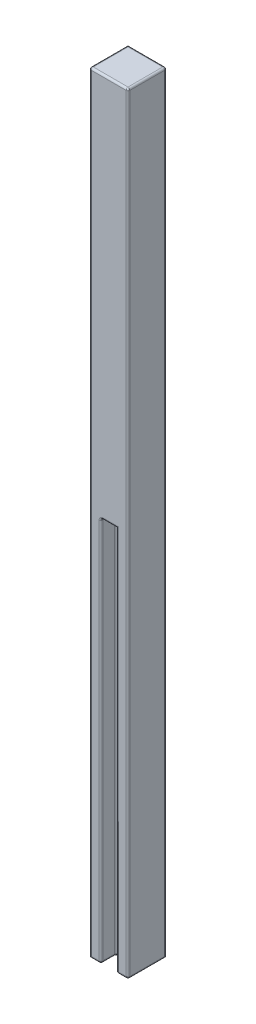
ISO-10303-21;
HEADER;
FILE_DESCRIPTION(('STEP AP214'),'2;1');
FILE_NAME('part.step','',(''),(''),'','','');
FILE_SCHEMA(('AUTOMOTIVE_DESIGN { 1 0 10303 214 1 1 1 1 }'));
ENDSEC;
DATA;
#1=APPLICATION_CONTEXT('core data for automotive mechanical design processes');
#2=APPLICATION_PROTOCOL_DEFINITION('international standard','automotive_design',2000,#1);
#3=PRODUCT_CONTEXT('',#1,'mechanical');
#4=PRODUCT('Part','Part','',(#3));
#5=PRODUCT_RELATED_PRODUCT_CATEGORY('part','',(#4));
#6=PRODUCT_DEFINITION_FORMATION('','',#4);
#7=PRODUCT_DEFINITION_CONTEXT('part definition',#1,'design');
#8=PRODUCT_DEFINITION('design','',#6,#7);
#9=PRODUCT_DEFINITION_SHAPE('','',#8);
#10=(LENGTH_UNIT() NAMED_UNIT(*) SI_UNIT(.MILLI.,.METRE.));
#11=(NAMED_UNIT(*) PLANE_ANGLE_UNIT() SI_UNIT($,.RADIAN.));
#12=(NAMED_UNIT(*) SI_UNIT($,.STERADIAN.) SOLID_ANGLE_UNIT());
#13=UNCERTAINTY_MEASURE_WITH_UNIT(LENGTH_MEASURE(1.E-05),#10,'distance_accuracy_value','');
#14=(GEOMETRIC_REPRESENTATION_CONTEXT(3) GLOBAL_UNCERTAINTY_ASSIGNED_CONTEXT((#13)) GLOBAL_UNIT_ASSIGNED_CONTEXT((#10,
#11,#12)) REPRESENTATION_CONTEXT('',''));
#15=CARTESIAN_POINT('',(0.,0.,0.));
#16=DIRECTION('',(0.,0.,1.));
#17=DIRECTION('',(1.,0.,0.));
#18=AXIS2_PLACEMENT_3D('',#15,#16,#17);
#19=CARTESIAN_POINT('',(-43.4918902303552,200.,-32.6944400252682));
#20=DIRECTION('',(1.,0.,0.));
#21=DIRECTION('',(0.,0.,-1.));
#22=AXIS2_PLACEMENT_3D('',#19,#20,#21);
#23=PLANE('',#22);
#24=DIRECTION('',(0.,-1.,0.));
#25=VECTOR('',#24,1.);
#26=CARTESIAN_POINT('',(-43.4918902303552,200.,-23.1944400252682));
#27=LINE('',#26,#25);
#28=CARTESIAN_POINT('',(-43.4918902303552,0.,-23.1944400252682));
#29=VERTEX_POINT('',#28);
#30=CARTESIAN_POINT('',(-43.4918902303552,199.5,-23.1944400252682));
#31=VERTEX_POINT('',#30);
#32=EDGE_CURVE('E58',#29,#31,#27,.F.);
#33=ORIENTED_EDGE('',*,*,#32,.T.);
#34=DIRECTION('',(0.,0.,1.));
#35=VECTOR('',#34,1.);
#36=CARTESIAN_POINT('',(-43.4918902303552,199.5,-32.6944400252682));
#37=LINE('',#36,#35);
#38=CARTESIAN_POINT('',(-43.4918902303552,199.5,-32.6944400252682));
#39=VERTEX_POINT('',#38);
#40=EDGE_CURVE('E187',#31,#39,#37,.F.);
#41=ORIENTED_EDGE('',*,*,#40,.T.);
#42=DIRECTION('',(0.,-1.,0.));
#43=VECTOR('',#42,1.);
#44=CARTESIAN_POINT('',(-43.4918902303552,200.,-32.6944400252682));
#45=LINE('',#44,#43);
#46=CARTESIAN_POINT('',(-43.4918902303552,0.,-32.6944400252682));
#47=VERTEX_POINT('',#46);
#48=EDGE_CURVE('E183',#39,#47,#45,.T.);
#49=ORIENTED_EDGE('',*,*,#48,.T.);
#50=DIRECTION('',(0.,0.,1.));
#51=VECTOR('',#50,1.);
#52=CARTESIAN_POINT('',(-43.4918902303552,0.,-32.6944400252682));
#53=LINE('',#52,#51);
#54=EDGE_CURVE('E186',#47,#29,#53,.T.);
#55=ORIENTED_EDGE('',*,*,#54,.T.);
#56=EDGE_LOOP('',(#33,#41,#49,#55));
#57=FACE_BOUND('',#56,.T.);
#58=ADVANCED_FACE('F35',(#57),#23,.F.);
#59=CARTESIAN_POINT('',(-43.4918902303552,200.,-22.6944400252682));
#60=DIRECTION('',(0.,0.,-1.));
#61=DIRECTION('',(-1.,0.,0.));
#62=AXIS2_PLACEMENT_3D('',#59,#60,#61);
#63=PLANE('',#62);
#64=CARTESIAN_POINT('',(-39.9918902303553,99.5,-22.6944400252682));
#65=DIRECTION('',(0.,0.,-1.));
#66=DIRECTION('',(-1.,0.,0.));
#67=AXIS2_PLACEMENT_3D('',#64,#65,#66);
#68=CIRCLE('',#67,1.);
#69=CARTESIAN_POINT('',(-39.9918902303553,100.5,-22.6944400252682));
#70=VERTEX_POINT('',#69);
#71=CARTESIAN_POINT('',(-40.9918902303553,99.5,-22.6944400252682));
#72=VERTEX_POINT('',#71);
#73=EDGE_CURVE('E254',#70,#72,#68,.F.);
#74=ORIENTED_EDGE('',*,*,#73,.F.);
#75=DIRECTION('',(1.,0.,0.));
#76=VECTOR('',#75,1.);
#77=CARTESIAN_POINT('',(-36.4918902303553,100.5,-22.6944400252682));
#78=LINE('',#77,#76);
#79=CARTESIAN_POINT('',(-35.9918902303553,100.5,-22.6944400252682));
#80=VERTEX_POINT('',#79);
#81=EDGE_CURVE('E256',#70,#80,#78,.T.);
#82=ORIENTED_EDGE('',*,*,#81,.T.);
#83=DIRECTION('',(0.,-1.,0.));
#84=VECTOR('',#83,1.);
#85=CARTESIAN_POINT('',(-35.9918902303553,0.,-22.6944400252682));
#86=LINE('',#85,#84);
#87=CARTESIAN_POINT('',(-35.9918902303553,0.5,-22.6944400252682));
#88=VERTEX_POINT('',#87);
#89=EDGE_CURVE('E252',#80,#88,#86,.T.);
#90=ORIENTED_EDGE('',*,*,#89,.T.);
#91=DIRECTION('',(1.,0.,0.));
#92=VECTOR('',#91,1.);
#93=CARTESIAN_POINT('',(-43.4918902303552,0.5,-22.6944400252682));
#94=LINE('',#93,#92);
#95=CARTESIAN_POINT('',(-33.9918902303552,0.5,-22.6944400252682));
#96=VERTEX_POINT('',#95);
#97=EDGE_CURVE('E250',#88,#96,#94,.T.);
#98=ORIENTED_EDGE('',*,*,#97,.T.);
#99=DIRECTION('',(0.,-1.,0.));
#100=VECTOR('',#99,1.);
#101=CARTESIAN_POINT('',(-33.9918902303552,200.,-22.6944400252682));
#102=LINE('',#101,#100);
#103=CARTESIAN_POINT('',(-33.9918902303552,199.5,-22.6944400252682));
#104=VERTEX_POINT('',#103);
#105=EDGE_CURVE('E248',#96,#104,#102,.F.);
#106=ORIENTED_EDGE('',*,*,#105,.T.);
#107=DIRECTION('',(1.,0.,0.));
#108=VECTOR('',#107,1.);
#109=CARTESIAN_POINT('',(-43.4918902303552,199.5,-22.6944400252682));
#110=LINE('',#109,#108);
#111=CARTESIAN_POINT('',(-42.9918902303552,199.5,-22.6944400252682));
#112=VERTEX_POINT('',#111);
#113=EDGE_CURVE('E241',#104,#112,#110,.F.);
#114=ORIENTED_EDGE('',*,*,#113,.T.);
#115=DIRECTION('',(0.,-1.,0.));
#116=VECTOR('',#115,1.);
#117=CARTESIAN_POINT('',(-42.9918902303552,200.,-22.6944400252682));
#118=LINE('',#117,#116);
#119=CARTESIAN_POINT('',(-42.9918902303552,0.5,-22.6944400252682));
#120=VERTEX_POINT('',#119);
#121=EDGE_CURVE('E239',#112,#120,#118,.T.);
#122=ORIENTED_EDGE('',*,*,#121,.T.);
#123=DIRECTION('',(1.,0.,0.));
#124=VECTOR('',#123,1.);
#125=CARTESIAN_POINT('',(-43.4918902303552,0.5,-22.6944400252682));
#126=LINE('',#125,#124);
#127=CARTESIAN_POINT('',(-40.9918902303553,0.5,-22.6944400252682));
#128=VERTEX_POINT('',#127);
#129=EDGE_CURVE('E243',#120,#128,#126,.T.);
#130=ORIENTED_EDGE('',*,*,#129,.T.);
#131=DIRECTION('',(0.,-1.,0.));
#132=VECTOR('',#131,1.);
#133=CARTESIAN_POINT('',(-40.9918902303553,200.,-22.6944400252682));
#134=LINE('',#133,#132);
#135=EDGE_CURVE('E245',#128,#72,#134,.F.);
#136=ORIENTED_EDGE('',*,*,#135,.T.);
#137=EDGE_LOOP('',(#74,#82,#90,#98,#106,#114,#122,#130,#136));
#138=FACE_BOUND('',#137,.T.);
#139=ADVANCED_FACE('F431',(#138),#63,.F.);
#140=CARTESIAN_POINT('',(-33.4918902303552,200.,-32.6944400252682));
#141=DIRECTION('',(-1.,0.,0.));
#142=DIRECTION('',(0.,0.,1.));
#143=AXIS2_PLACEMENT_3D('',#140,#141,#142);
#144=PLANE('',#143);
#145=DIRECTION('',(0.,0.,-1.));
#146=VECTOR('',#145,1.);
#147=CARTESIAN_POINT('',(-33.4918902303552,0.5,-32.6944400252682));
#148=LINE('',#147,#146);
#149=CARTESIAN_POINT('',(-33.4918902303552,0.5,-23.1944400252682));
#150=VERTEX_POINT('',#149);
#151=CARTESIAN_POINT('',(-33.4918902303552,0.5,-32.1944400252682));
#152=VERTEX_POINT('',#151);
#153=EDGE_CURVE('E277',#150,#152,#148,.T.);
#154=ORIENTED_EDGE('',*,*,#153,.T.);
#155=DIRECTION('',(0.,-1.,0.));
#156=VECTOR('',#155,1.);
#157=CARTESIAN_POINT('',(-33.4918902303552,200.,-32.1944400252682));
#158=LINE('',#157,#156);
#159=CARTESIAN_POINT('',(-33.4918902303552,199.5,-32.1944400252682));
#160=VERTEX_POINT('',#159);
#161=EDGE_CURVE('E280',#152,#160,#158,.F.);
#162=ORIENTED_EDGE('',*,*,#161,.T.);
#163=DIRECTION('',(0.,0.,-1.));
#164=VECTOR('',#163,1.);
#165=CARTESIAN_POINT('',(-33.4918902303552,199.5,-22.6944400252682));
#166=LINE('',#165,#164);
#167=CARTESIAN_POINT('',(-33.4918902303552,199.5,-23.1944400252682));
#168=VERTEX_POINT('',#167);
#169=EDGE_CURVE('E275',#160,#168,#166,.F.);
#170=ORIENTED_EDGE('',*,*,#169,.T.);
#171=DIRECTION('',(0.,-1.,0.));
#172=VECTOR('',#171,1.);
#173=CARTESIAN_POINT('',(-33.4918902303552,200.,-23.1944400252682));
#174=LINE('',#173,#172);
#175=EDGE_CURVE('E273',#168,#150,#174,.T.);
#176=ORIENTED_EDGE('',*,*,#175,.T.);
#177=EDGE_LOOP('',(#154,#162,#170,#176));
#178=FACE_BOUND('',#177,.T.);
#179=ADVANCED_FACE('F436',(#178),#144,.F.);
#180=CARTESIAN_POINT('',(-43.4918902303552,200.,-32.6944400252682));
#181=DIRECTION('',(0.,0.,1.));
#182=DIRECTION('',(1.,0.,0.));
#183=AXIS2_PLACEMENT_3D('',#180,#181,#182);
#184=PLANE('',#183);
#185=ORIENTED_EDGE('',*,*,#48,.F.);
#186=DIRECTION('',(-1.,0.,0.));
#187=VECTOR('',#186,1.);
#188=CARTESIAN_POINT('',(-33.4918902303552,199.5,-32.6944400252682));
#189=LINE('',#188,#187);
#190=CARTESIAN_POINT('',(-33.9918902303552,199.5,-32.6944400252682));
#191=VERTEX_POINT('',#190);
#192=EDGE_CURVE('E11',#39,#191,#189,.F.);
#193=ORIENTED_EDGE('',*,*,#192,.T.);
#194=DIRECTION('',(0.,-1.,0.));
#195=VECTOR('',#194,1.);
#196=CARTESIAN_POINT('',(-33.9918902303552,200.,-32.6944400252682));
#197=LINE('',#196,#195);
#198=CARTESIAN_POINT('',(-33.9918902303552,0.,-32.6944400252682));
#199=VERTEX_POINT('',#198);
#200=EDGE_CURVE('E44',#191,#199,#197,.T.);
#201=ORIENTED_EDGE('',*,*,#200,.T.);
#202=DIRECTION('',(-1.,0.,0.));
#203=VECTOR('',#202,1.);
#204=CARTESIAN_POINT('',(-43.4918902303552,0.,-32.6944400252682));
#205=LINE('',#204,#203);
#206=EDGE_CURVE('E190',#199,#47,#205,.T.);
#207=ORIENTED_EDGE('',*,*,#206,.T.);
#208=EDGE_LOOP('',(#185,#193,#201,#207));
#209=FACE_BOUND('',#208,.T.);
#210=ADVANCED_FACE('F193',(#209),#184,.F.);
#211=CARTESIAN_POINT('',(0.,200.,0.));
#212=DIRECTION('',(0.,1.,0.));
#213=DIRECTION('',(0.,0.,1.));
#214=AXIS2_PLACEMENT_3D('',#211,#212,#213);
#215=PLANE('',#214);
#216=DIRECTION('',(-1.,0.,0.));
#217=VECTOR('',#216,1.);
#218=CARTESIAN_POINT('',(-43.4918902303552,200.,-32.1944400252682));
#219=LINE('',#218,#217);
#220=CARTESIAN_POINT('',(-33.9918902303552,200.,-32.1944400252682));
#221=VERTEX_POINT('',#220);
#222=CARTESIAN_POINT('',(-42.9918902303552,200.,-32.1944400252682));
#223=VERTEX_POINT('',#222);
#224=EDGE_CURVE('E282',#221,#223,#219,.T.);
#225=ORIENTED_EDGE('',*,*,#224,.T.);
#226=DIRECTION('',(0.,0.,1.));
#227=VECTOR('',#226,1.);
#228=CARTESIAN_POINT('',(-42.9918902303552,200.,-22.6944400252682));
#229=LINE('',#228,#227);
#230=CARTESIAN_POINT('',(-42.9918902303552,200.,-23.1944400252682));
#231=VERTEX_POINT('',#230);
#232=EDGE_CURVE('E288',#223,#231,#229,.T.);
#233=ORIENTED_EDGE('',*,*,#232,.T.);
#234=DIRECTION('',(1.,0.,0.));
#235=VECTOR('',#234,1.);
#236=CARTESIAN_POINT('',(-33.4918902303552,200.,-23.1944400252682));
#237=LINE('',#236,#235);
#238=CARTESIAN_POINT('',(-33.9918902303552,200.,-23.1944400252682));
#239=VERTEX_POINT('',#238);
#240=EDGE_CURVE('E286',#231,#239,#237,.T.);
#241=ORIENTED_EDGE('',*,*,#240,.T.);
#242=DIRECTION('',(0.,0.,-1.));
#243=VECTOR('',#242,1.);
#244=CARTESIAN_POINT('',(-33.9918902303552,200.,-32.6944400252682));
#245=LINE('',#244,#243);
#246=EDGE_CURVE('E284',#239,#221,#245,.T.);
#247=ORIENTED_EDGE('',*,*,#246,.T.);
#248=EDGE_LOOP('',(#225,#233,#241,#247));
#249=FACE_BOUND('',#248,.T.);
#250=ADVANCED_FACE('F405',(#249),#215,.T.);
#251=CARTESIAN_POINT('',(0.,0.,0.));
#252=DIRECTION('',(0.,1.,0.));
#253=DIRECTION('',(0.,0.,1.));
#254=AXIS2_PLACEMENT_3D('',#251,#252,#253);
#255=PLANE('',#254);
#256=DIRECTION('',(0.,0.,1.));
#257=VECTOR('',#256,1.);
#258=CARTESIAN_POINT('',(-40.9918902303553,0.,0.));
#259=LINE('',#258,#257);
#260=CARTESIAN_POINT('',(-40.9918902303553,0.,-26.1944400252682));
#261=VERTEX_POINT('',#260);
#262=CARTESIAN_POINT('',(-40.9918902303553,0.,-23.1944400252682));
#263=VERTEX_POINT('',#262);
#264=EDGE_CURVE('E227',#261,#263,#259,.T.);
#265=ORIENTED_EDGE('',*,*,#264,.T.);
#266=DIRECTION('',(1.,0.,0.));
#267=VECTOR('',#266,1.);
#268=CARTESIAN_POINT('',(0.,0.,-23.1944400252682));
#269=LINE('',#268,#267);
#270=EDGE_CURVE('E200',#263,#29,#269,.F.);
#271=ORIENTED_EDGE('',*,*,#270,.T.);
#272=ORIENTED_EDGE('',*,*,#54,.F.);
#273=ORIENTED_EDGE('',*,*,#206,.F.);
#274=DIRECTION('',(0.,0.,-1.));
#275=VECTOR('',#274,1.);
#276=CARTESIAN_POINT('',(-33.9918902303552,0.,0.));
#277=LINE('',#276,#275);
#278=CARTESIAN_POINT('',(-33.9918902303552,0.,-23.1944400252682));
#279=VERTEX_POINT('',#278);
#280=EDGE_CURVE('E212',#199,#279,#277,.F.);
#281=ORIENTED_EDGE('',*,*,#280,.T.);
#282=DIRECTION('',(1.,0.,0.));
#283=VECTOR('',#282,1.);
#284=CARTESIAN_POINT('',(0.,0.,-23.1944400252682));
#285=LINE('',#284,#283);
#286=CARTESIAN_POINT('',(-35.9918902303553,0.,-23.1944400252682));
#287=VERTEX_POINT('',#286);
#288=EDGE_CURVE('E214',#279,#287,#285,.F.);
#289=ORIENTED_EDGE('',*,*,#288,.T.);
#290=DIRECTION('',(0.,0.,1.));
#291=VECTOR('',#290,1.);
#292=CARTESIAN_POINT('',(-35.9918902303553,0.,-26.6944400252682));
#293=LINE('',#292,#291);
#294=CARTESIAN_POINT('',(-35.9918902303553,0.,-26.1944400252682));
#295=VERTEX_POINT('',#294);
#296=EDGE_CURVE('E216',#287,#295,#293,.F.);
#297=ORIENTED_EDGE('',*,*,#296,.T.);
#298=CARTESIAN_POINT('',(-36.9918902303553,0.,-26.1944400252682));
#299=DIRECTION('',(0.,1.,0.));
#300=DIRECTION('',(0.,0.,1.));
#301=AXIS2_PLACEMENT_3D('',#298,#299,#300);
#302=CIRCLE('',#301,1.);
#303=CARTESIAN_POINT('',(-36.9918902303553,0.,-27.1944400252682));
#304=VERTEX_POINT('',#303);
#305=EDGE_CURVE('E219',#304,#295,#302,.F.);
#306=ORIENTED_EDGE('',*,*,#305,.F.);
#307=DIRECTION('',(1.,0.,0.));
#308=VECTOR('',#307,1.);
#309=CARTESIAN_POINT('',(-40.4918902303553,0.,-27.1944400252682));
#310=LINE('',#309,#308);
#311=CARTESIAN_POINT('',(-39.9918902303553,0.,-27.1944400252682));
#312=VERTEX_POINT('',#311);
#313=EDGE_CURVE('E222',#304,#312,#310,.F.);
#314=ORIENTED_EDGE('',*,*,#313,.T.);
#315=CARTESIAN_POINT('',(-39.9918902303553,0.,-26.1944400252682));
#316=DIRECTION('',(0.,1.,0.));
#317=DIRECTION('',(0.,0.,1.));
#318=AXIS2_PLACEMENT_3D('',#315,#316,#317);
#319=CIRCLE('',#318,1.);
#320=EDGE_CURVE('E224',#261,#312,#319,.F.);
#321=ORIENTED_EDGE('',*,*,#320,.F.);
#322=EDGE_LOOP('',(#265,#271,#272,#273,#281,#289,#297,#306,#314,#321));
#323=FACE_BOUND('',#322,.T.);
#324=ADVANCED_FACE('F198',(#323),#255,.F.);
#325=CARTESIAN_POINT('',(-40.4918902303553,100.,-26.6944400252682));
#326=DIRECTION('',(-1.,0.,0.));
#327=DIRECTION('',(0.,-1.,0.));
#328=AXIS2_PLACEMENT_3D('',#325,#326,#327);
#329=PLANE('',#328);
#330=DIRECTION('',(0.,-1.,0.));
#331=VECTOR('',#330,1.);
#332=CARTESIAN_POINT('',(-40.4918902303553,100.,-23.1944400252682));
#333=LINE('',#332,#331);
#334=CARTESIAN_POINT('',(-40.4918902303553,99.5,-23.1944400252682));
#335=VERTEX_POINT('',#334);
#336=CARTESIAN_POINT('',(-40.4918902303553,0.5,-23.1944400252682));
#337=VERTEX_POINT('',#336);
#338=EDGE_CURVE('E234',#335,#337,#333,.T.);
#339=ORIENTED_EDGE('',*,*,#338,.T.);
#340=DIRECTION('',(0.,0.,1.));
#341=VECTOR('',#340,1.);
#342=CARTESIAN_POINT('',(-40.4918902303553,0.5,-26.6944400252682));
#343=LINE('',#342,#341);
#344=CARTESIAN_POINT('',(-40.4918902303553,0.5,-26.1944400252682));
#345=VERTEX_POINT('',#344);
#346=EDGE_CURVE('E237',#337,#345,#343,.F.);
#347=ORIENTED_EDGE('',*,*,#346,.T.);
#348=DIRECTION('',(0.,-1.,0.));
#349=VECTOR('',#348,1.);
#350=CARTESIAN_POINT('',(-40.4918902303553,100.,-26.1944400252682));
#351=LINE('',#350,#349);
#352=CARTESIAN_POINT('',(-40.4918902303553,99.5,-26.1944400252682));
#353=VERTEX_POINT('',#352);
#354=EDGE_CURVE('E232',#345,#353,#351,.F.);
#355=ORIENTED_EDGE('',*,*,#354,.T.);
#356=DIRECTION('',(0.,0.,1.));
#357=VECTOR('',#356,1.);
#358=CARTESIAN_POINT('',(-40.4918902303553,99.5,-26.6944400252682));
#359=LINE('',#358,#357);
#360=EDGE_CURVE('E230',#353,#335,#359,.T.);
#361=ORIENTED_EDGE('',*,*,#360,.T.);
#362=EDGE_LOOP('',(#339,#347,#355,#361));
#363=FACE_BOUND('',#362,.T.);
#364=ADVANCED_FACE('F740',(#363),#329,.F.);
#365=CARTESIAN_POINT('',(-40.4918902303553,100.,-26.6944400252682));
#366=DIRECTION('',(0.,-1.,0.));
#367=DIRECTION('',(0.,0.,-1.));
#368=AXIS2_PLACEMENT_3D('',#365,#366,#367);
#369=PLANE('',#368);
#370=DIRECTION('',(0.,0.,1.));
#371=VECTOR('',#370,1.);
#372=CARTESIAN_POINT('',(-36.4918902303553,100.,-26.6944400252682));
#373=LINE('',#372,#371);
#374=CARTESIAN_POINT('',(-36.4918902303553,100.,-26.1944400252682));
#375=VERTEX_POINT('',#374);
#376=CARTESIAN_POINT('',(-36.4918902303553,100.,-23.1944400252682));
#377=VERTEX_POINT('',#376);
#378=EDGE_CURVE('E201',#375,#377,#373,.T.);
#379=ORIENTED_EDGE('',*,*,#378,.T.);
#380=DIRECTION('',(1.,0.,0.));
#381=VECTOR('',#380,1.);
#382=CARTESIAN_POINT('',(-40.4918902303553,100.,-23.1944400252682));
#383=LINE('',#382,#381);
#384=CARTESIAN_POINT('',(-39.9918902303553,100.,-23.1944400252682));
#385=VERTEX_POINT('',#384);
#386=EDGE_CURVE('E262',#377,#385,#383,.F.);
#387=ORIENTED_EDGE('',*,*,#386,.T.);
#388=DIRECTION('',(0.,0.,1.));
#389=VECTOR('',#388,1.);
#390=CARTESIAN_POINT('',(-39.9918902303553,100.,-26.6944400252682));
#391=LINE('',#390,#389);
#392=CARTESIAN_POINT('',(-39.9918902303553,100.,-26.1944400252682));
#393=VERTEX_POINT('',#392);
#394=EDGE_CURVE('E258',#385,#393,#391,.F.);
#395=ORIENTED_EDGE('',*,*,#394,.T.);
#396=DIRECTION('',(1.,0.,0.));
#397=VECTOR('',#396,1.);
#398=CARTESIAN_POINT('',(-36.4918902303553,100.,-26.1944400252682));
#399=LINE('',#398,#397);
#400=EDGE_CURVE('E260',#393,#375,#399,.T.);
#401=ORIENTED_EDGE('',*,*,#400,.T.);
#402=EDGE_LOOP('',(#379,#387,#395,#401));
#403=FACE_BOUND('',#402,.T.);
#404=ADVANCED_FACE('F731',(#403),#369,.T.);
#405=CARTESIAN_POINT('',(-36.4918902303553,100.,-26.6944400252682));
#406=DIRECTION('',(-1.,0.,0.));
#407=DIRECTION('',(0.,-1.,0.));
#408=AXIS2_PLACEMENT_3D('',#405,#406,#407);
#409=PLANE('',#408);
#410=DIRECTION('',(0.,0.,1.));
#411=VECTOR('',#410,1.);
#412=CARTESIAN_POINT('',(-36.4918902303553,0.5,-22.6944400252682));
#413=LINE('',#412,#411);
#414=CARTESIAN_POINT('',(-36.4918902303553,0.5,-26.1944400252682));
#415=VERTEX_POINT('',#414);
#416=CARTESIAN_POINT('',(-36.4918902303553,0.5,-23.1944400252682));
#417=VERTEX_POINT('',#416);
#418=EDGE_CURVE('E207',#415,#417,#413,.T.);
#419=ORIENTED_EDGE('',*,*,#418,.T.);
#420=DIRECTION('',(0.,-1.,0.));
#421=VECTOR('',#420,1.);
#422=CARTESIAN_POINT('',(-36.4918902303553,100.,-23.1944400252682));
#423=LINE('',#422,#421);
#424=EDGE_CURVE('E210',#417,#377,#423,.F.);
#425=ORIENTED_EDGE('',*,*,#424,.T.);
#426=ORIENTED_EDGE('',*,*,#378,.F.);
#427=DIRECTION('',(0.,-1.,0.));
#428=VECTOR('',#427,1.);
#429=CARTESIAN_POINT('',(-36.4918902303553,0.,-26.1944400252682));
#430=LINE('',#429,#428);
#431=EDGE_CURVE('E189',#375,#415,#430,.T.);
#432=ORIENTED_EDGE('',*,*,#431,.T.);
#433=EDGE_LOOP('',(#419,#425,#426,#432));
#434=FACE_BOUND('',#433,.T.);
#435=ADVANCED_FACE('F427',(#434),#409,.T.);
#436=CARTESIAN_POINT('',(0.,0.,-26.6944400252682));
#437=DIRECTION('',(0.,0.,1.));
#438=DIRECTION('',(1.,0.,0.));
#439=AXIS2_PLACEMENT_3D('',#436,#437,#438);
#440=PLANE('',#439);
#441=DIRECTION('',(1.,0.,0.));
#442=VECTOR('',#441,1.);
#443=CARTESIAN_POINT('',(-40.4918902303553,99.5,-26.6944400252682));
#444=LINE('',#443,#442);
#445=CARTESIAN_POINT('',(-36.9918902303553,99.5,-26.6944400252682));
#446=VERTEX_POINT('',#445);
#447=CARTESIAN_POINT('',(-39.9918902303553,99.5,-26.6944400252682));
#448=VERTEX_POINT('',#447);
#449=EDGE_CURVE('E264',#446,#448,#444,.F.);
#450=ORIENTED_EDGE('',*,*,#449,.T.);
#451=DIRECTION('',(0.,-1.,0.));
#452=VECTOR('',#451,1.);
#453=CARTESIAN_POINT('',(-39.9918902303553,0.,-26.6944400252682));
#454=LINE('',#453,#452);
#455=CARTESIAN_POINT('',(-39.9918902303553,0.5,-26.6944400252682));
#456=VERTEX_POINT('',#455);
#457=EDGE_CURVE('E270',#448,#456,#454,.T.);
#458=ORIENTED_EDGE('',*,*,#457,.T.);
#459=DIRECTION('',(1.,0.,0.));
#460=VECTOR('',#459,1.);
#461=CARTESIAN_POINT('',(-36.4918902303553,0.5,-26.6944400252682));
#462=LINE('',#461,#460);
#463=CARTESIAN_POINT('',(-36.9918902303553,0.5,-26.6944400252682));
#464=VERTEX_POINT('',#463);
#465=EDGE_CURVE('E268',#456,#464,#462,.T.);
#466=ORIENTED_EDGE('',*,*,#465,.T.);
#467=DIRECTION('',(0.,-1.,0.));
#468=VECTOR('',#467,1.);
#469=CARTESIAN_POINT('',(-36.9918902303553,100.,-26.6944400252682));
#470=LINE('',#469,#468);
#471=EDGE_CURVE('E266',#464,#446,#470,.F.);
#472=ORIENTED_EDGE('',*,*,#471,.T.);
#473=EDGE_LOOP('',(#450,#458,#466,#472));
#474=FACE_BOUND('',#473,.T.);
#475=ADVANCED_FACE('F422',(#474),#440,.T.);
#476=CARTESIAN_POINT('',(-42.9918902303552,199.5,0.));
#477=DIRECTION('',(0.,0.,-1.));
#478=DIRECTION('',(-1.,0.,0.));
#479=AXIS2_PLACEMENT_3D('',#476,#477,#478);
#480=CYLINDRICAL_SURFACE('',#479,0.5);
#481=CARTESIAN_POINT('',(-42.9918902303552,199.5,-32.1944400252682));
#482=DIRECTION('',(0.707106781186547,0.,-0.707106781186548));
#483=DIRECTION('',(0.707106781186548,0.,0.707106781186547));
#484=AXIS2_PLACEMENT_3D('',#481,#482,#483);
#485=ELLIPSE('',#484,0.707106781186548,0.5);
#486=EDGE_CURVE('E387',#39,#223,#485,.T.);
#487=ORIENTED_EDGE('',*,*,#486,.F.);
#488=ORIENTED_EDGE('',*,*,#40,.F.);
#489=CARTESIAN_POINT('',(-42.9918902303552,199.5,-23.1944400252682));
#490=DIRECTION('',(0.,0.,1.));
#491=DIRECTION('',(1.,0.,0.));
#492=AXIS2_PLACEMENT_3D('',#489,#490,#491);
#493=CIRCLE('',#492,0.5);
#494=EDGE_CURVE('E389',#231,#31,#493,.T.);
#495=ORIENTED_EDGE('',*,*,#494,.F.);
#496=ORIENTED_EDGE('',*,*,#232,.F.);
#497=EDGE_LOOP('',(#487,#488,#495,#496));
#498=FACE_BOUND('',#497,.T.);
#499=ADVANCED_FACE('F37',(#498),#480,.T.);
#500=CARTESIAN_POINT('',(-42.9918902303552,200.,-23.1944400252682));
#501=DIRECTION('',(0.,-1.,0.));
#502=DIRECTION('',(0.,0.,-1.));
#503=AXIS2_PLACEMENT_3D('',#500,#501,#502);
#504=CYLINDRICAL_SURFACE('',#503,0.5);
#505=CARTESIAN_POINT('',(-42.9918902303552,199.5,-23.1944400252682));
#506=DIRECTION('',(0.,1.,0.));
#507=DIRECTION('',(0.,0.,1.));
#508=AXIS2_PLACEMENT_3D('',#505,#506,#507);
#509=CIRCLE('',#508,0.5);
#510=EDGE_CURVE('E39',#31,#112,#509,.T.);
#511=ORIENTED_EDGE('',*,*,#510,.F.);
#512=ORIENTED_EDGE('',*,*,#32,.F.);
#513=CARTESIAN_POINT('',(-42.9918902303552,0.5,-23.1944400252682));
#514=DIRECTION('',(0.707106781186547,-0.707106781186547,0.));
#515=DIRECTION('',(-0.707106781186547,-0.707106781186547,0.));
#516=AXIS2_PLACEMENT_3D('',#513,#514,#515);
#517=ELLIPSE('',#516,0.707106781186547,0.5);
#518=EDGE_CURVE('E384',#120,#29,#517,.T.);
#519=ORIENTED_EDGE('',*,*,#518,.F.);
#520=ORIENTED_EDGE('',*,*,#121,.F.);
#521=EDGE_LOOP('',(#511,#512,#519,#520));
#522=FACE_BOUND('',#521,.T.);
#523=ADVANCED_FACE('F421',(#522),#504,.T.);
#524=CARTESIAN_POINT('',(-42.9918902303552,199.5,-23.1944400252682));
#525=DIRECTION('',(0.,0.,1.));
#526=DIRECTION('',(1.,0.,0.));
#527=AXIS2_PLACEMENT_3D('',#524,#525,#526);
#528=SPHERICAL_SURFACE('',#527,0.5);
#529=ORIENTED_EDGE('',*,*,#494,.T.);
#530=ORIENTED_EDGE('',*,*,#510,.T.);
#531=CARTESIAN_POINT('',(-42.9918902303552,199.5,-23.1944400252682));
#532=DIRECTION('',(-1.,0.,0.));
#533=DIRECTION('',(0.,0.,1.));
#534=AXIS2_PLACEMENT_3D('',#531,#532,#533);
#535=CIRCLE('',#534,0.5);
#536=EDGE_CURVE('E381',#231,#112,#535,.F.);
#537=ORIENTED_EDGE('',*,*,#536,.F.);
#538=EDGE_LOOP('',(#529,#530,#537));
#539=FACE_BOUND('',#538,.T.);
#540=ADVANCED_FACE('F396',(#539),#528,.T.);
#541=CARTESIAN_POINT('',(0.,199.5,-32.1944400252682));
#542=DIRECTION('',(1.,0.,0.));
#543=DIRECTION('',(0.,0.,-1.));
#544=AXIS2_PLACEMENT_3D('',#541,#542,#543);
#545=CYLINDRICAL_SURFACE('',#544,0.5);
#546=ORIENTED_EDGE('',*,*,#486,.T.);
#547=ORIENTED_EDGE('',*,*,#224,.F.);
#548=CARTESIAN_POINT('',(-33.9918902303552,199.5,-32.1944400252682));
#549=DIRECTION('',(1.,0.,0.));
#550=DIRECTION('',(0.,0.,-1.));
#551=AXIS2_PLACEMENT_3D('',#548,#549,#550);
#552=CIRCLE('',#551,0.5);
#553=EDGE_CURVE('E375',#191,#221,#552,.T.);
#554=ORIENTED_EDGE('',*,*,#553,.F.);
#555=ORIENTED_EDGE('',*,*,#192,.F.);
#556=EDGE_LOOP('',(#546,#547,#554,#555));
#557=FACE_BOUND('',#556,.T.);
#558=ADVANCED_FACE('F418',(#557),#545,.T.);
#559=CARTESIAN_POINT('',(-43.4918902303552,0.5,-23.1944400252682));
#560=DIRECTION('',(1.,0.,0.));
#561=DIRECTION('',(0.,0.,-1.));
#562=AXIS2_PLACEMENT_3D('',#559,#560,#561);
#563=CYLINDRICAL_SURFACE('',#562,0.5);
#564=ORIENTED_EDGE('',*,*,#518,.T.);
#565=ORIENTED_EDGE('',*,*,#270,.F.);
#566=CARTESIAN_POINT('',(-40.9918902303553,0.5,-23.1944400252682));
#567=DIRECTION('',(1.,0.,0.));
#568=DIRECTION('',(0.,0.,-1.));
#569=AXIS2_PLACEMENT_3D('',#566,#567,#568);
#570=CIRCLE('',#569,0.5);
#571=EDGE_CURVE('E372',#128,#263,#570,.T.);
#572=ORIENTED_EDGE('',*,*,#571,.F.);
#573=ORIENTED_EDGE('',*,*,#129,.F.);
#574=EDGE_LOOP('',(#564,#565,#572,#573));
#575=FACE_BOUND('',#574,.T.);
#576=ADVANCED_FACE('F535',(#575),#563,.T.);
#577=CARTESIAN_POINT('',(0.,199.5,-23.1944400252682));
#578=DIRECTION('',(-1.,0.,0.));
#579=DIRECTION('',(0.,0.,1.));
#580=AXIS2_PLACEMENT_3D('',#577,#578,#579);
#581=CYLINDRICAL_SURFACE('',#580,0.5);
#582=ORIENTED_EDGE('',*,*,#536,.T.);
#583=ORIENTED_EDGE('',*,*,#113,.F.);
#584=CARTESIAN_POINT('',(-33.9918902303552,199.5,-23.1944400252682));
#585=DIRECTION('',(1.,0.,0.));
#586=DIRECTION('',(0.,0.,-1.));
#587=AXIS2_PLACEMENT_3D('',#584,#585,#586);
#588=CIRCLE('',#587,0.5);
#589=EDGE_CURVE('E366',#239,#104,#588,.T.);
#590=ORIENTED_EDGE('',*,*,#589,.F.);
#591=ORIENTED_EDGE('',*,*,#240,.F.);
#592=EDGE_LOOP('',(#582,#583,#590,#591));
#593=FACE_BOUND('',#592,.T.);
#594=ADVANCED_FACE('F401',(#593),#581,.T.);
#595=CARTESIAN_POINT('',(-33.9918902303552,199.5,0.));
#596=DIRECTION('',(0.,0.,1.));
#597=DIRECTION('',(1.,0.,0.));
#598=AXIS2_PLACEMENT_3D('',#595,#596,#597);
#599=CYLINDRICAL_SURFACE('',#598,0.5);
#600=CARTESIAN_POINT('',(-33.9918902303552,199.5,-32.1944400252682));
#601=DIRECTION('',(0.,0.,-1.));
#602=DIRECTION('',(-1.,0.,0.));
#603=AXIS2_PLACEMENT_3D('',#600,#601,#602);
#604=CIRCLE('',#603,0.5);
#605=EDGE_CURVE('E378',#221,#160,#604,.T.);
#606=ORIENTED_EDGE('',*,*,#605,.F.);
#607=ORIENTED_EDGE('',*,*,#246,.F.);
#608=CARTESIAN_POINT('',(-33.9918902303552,199.5,-23.1944400252682));
#609=DIRECTION('',(0.,0.,1.));
#610=DIRECTION('',(1.,0.,0.));
#611=AXIS2_PLACEMENT_3D('',#608,#609,#610);
#612=CIRCLE('',#611,0.5);
#613=EDGE_CURVE('E363',#168,#239,#612,.T.);
#614=ORIENTED_EDGE('',*,*,#613,.F.);
#615=ORIENTED_EDGE('',*,*,#169,.F.);
#616=EDGE_LOOP('',(#606,#607,#614,#615));
#617=FACE_BOUND('',#616,.T.);
#618=ADVANCED_FACE('F411',(#617),#599,.T.);
#619=CARTESIAN_POINT('',(-33.9918902303552,199.5,-32.1944400252682));
#620=DIRECTION('',(0.,0.,1.));
#621=DIRECTION('',(1.,0.,0.));
#622=AXIS2_PLACEMENT_3D('',#619,#620,#621);
#623=SPHERICAL_SURFACE('',#622,0.5);
#624=ORIENTED_EDGE('',*,*,#553,.T.);
#625=ORIENTED_EDGE('',*,*,#605,.T.);
#626=CARTESIAN_POINT('',(-33.9918902303552,199.5,-32.1944400252682));
#627=DIRECTION('',(0.,1.,0.));
#628=DIRECTION('',(0.,0.,1.));
#629=AXIS2_PLACEMENT_3D('',#626,#627,#628);
#630=CIRCLE('',#629,0.5);
#631=EDGE_CURVE('E360',#191,#160,#630,.F.);
#632=ORIENTED_EDGE('',*,*,#631,.F.);
#633=EDGE_LOOP('',(#624,#625,#632));
#634=FACE_BOUND('',#633,.T.);
#635=ADVANCED_FACE('F416',(#634),#623,.T.);
#636=CARTESIAN_POINT('',(-40.9918902303553,0.5,-23.1944400252682));
#637=DIRECTION('',(0.,0.,1.));
#638=DIRECTION('',(1.,0.,0.));
#639=AXIS2_PLACEMENT_3D('',#636,#637,#638);
#640=SPHERICAL_SURFACE('',#639,0.5);
#641=CARTESIAN_POINT('',(-40.9918902303553,0.5,-23.1944400252682));
#642=DIRECTION('',(0.,0.,1.));
#643=DIRECTION('',(1.,0.,0.));
#644=AXIS2_PLACEMENT_3D('',#641,#642,#643);
#645=CIRCLE('',#644,0.5);
#646=EDGE_CURVE('E357',#337,#263,#645,.F.);
#647=ORIENTED_EDGE('',*,*,#646,.F.);
#648=CARTESIAN_POINT('',(-40.9918902303553,0.5,-23.1944400252682));
#649=DIRECTION('',(0.,-1.,0.));
#650=DIRECTION('',(0.,0.,-1.));
#651=AXIS2_PLACEMENT_3D('',#648,#649,#650);
#652=CIRCLE('',#651,0.5);
#653=EDGE_CURVE('E369',#128,#337,#652,.F.);
#654=ORIENTED_EDGE('',*,*,#653,.F.);
#655=ORIENTED_EDGE('',*,*,#571,.T.);
#656=EDGE_LOOP('',(#647,#654,#655));
#657=FACE_BOUND('',#656,.T.);
#658=ADVANCED_FACE('F524',(#657),#640,.T.);
#659=CARTESIAN_POINT('',(-39.9918902303553,99.5,-26.6944400252682));
#660=DIRECTION('',(0.,0.,1.));
#661=DIRECTION('',(1.,0.,0.));
#662=AXIS2_PLACEMENT_3D('',#659,#660,#661);
#663=CYLINDRICAL_SURFACE('',#662,0.5);
#664=CARTESIAN_POINT('',(-39.9918902303553,99.5,-23.1944400252682));
#665=DIRECTION('',(0.,0.,-1.));
#666=DIRECTION('',(-1.,0.,0.));
#667=AXIS2_PLACEMENT_3D('',#664,#665,#666);
#668=CIRCLE('',#667,0.5);
#669=EDGE_CURVE('E348',#335,#385,#668,.T.);
#670=ORIENTED_EDGE('',*,*,#669,.F.);
#671=ORIENTED_EDGE('',*,*,#360,.F.);
#672=CARTESIAN_POINT('',(-39.9918902303553,99.5,-26.1944400252682));
#673=DIRECTION('',(0.,0.,1.));
#674=DIRECTION('',(1.,0.,0.));
#675=AXIS2_PLACEMENT_3D('',#672,#673,#674);
#676=CIRCLE('',#675,0.5);
#677=EDGE_CURVE('E351',#393,#353,#676,.T.);
#678=ORIENTED_EDGE('',*,*,#677,.F.);
#679=ORIENTED_EDGE('',*,*,#394,.F.);
#680=EDGE_LOOP('',(#670,#671,#678,#679));
#681=FACE_BOUND('',#680,.T.);
#682=ADVANCED_FACE('F520',(#681),#663,.F.);
#683=CARTESIAN_POINT('',(-40.9918902303553,100.,-23.1944400252682));
#684=DIRECTION('',(0.,-1.,0.));
#685=DIRECTION('',(1.,0.,0.));
#686=AXIS2_PLACEMENT_3D('',#683,#684,#685);
#687=CYLINDRICAL_SURFACE('',#686,0.5);
#688=ORIENTED_EDGE('',*,*,#653,.T.);
#689=ORIENTED_EDGE('',*,*,#338,.F.);
#690=CARTESIAN_POINT('',(-40.9918902303553,99.5,-23.1944400252682));
#691=DIRECTION('',(0.,1.,0.));
#692=DIRECTION('',(0.,0.,1.));
#693=AXIS2_PLACEMENT_3D('',#690,#691,#692);
#694=CIRCLE('',#693,0.5);
#695=EDGE_CURVE('E345',#72,#335,#694,.T.);
#696=ORIENTED_EDGE('',*,*,#695,.F.);
#697=ORIENTED_EDGE('',*,*,#135,.F.);
#698=EDGE_LOOP('',(#688,#689,#696,#697));
#699=FACE_BOUND('',#698,.T.);
#700=ADVANCED_FACE('F516',(#699),#687,.T.);
#701=CARTESIAN_POINT('',(-33.9918902303552,199.5,-23.1944400252682));
#702=DIRECTION('',(0.,0.,1.));
#703=DIRECTION('',(1.,0.,0.));
#704=AXIS2_PLACEMENT_3D('',#701,#702,#703);
#705=SPHERICAL_SURFACE('',#704,0.5);
#706=ORIENTED_EDGE('',*,*,#613,.T.);
#707=ORIENTED_EDGE('',*,*,#589,.T.);
#708=CARTESIAN_POINT('',(-33.9918902303552,199.5,-23.1944400252682));
#709=DIRECTION('',(0.,1.,0.));
#710=DIRECTION('',(0.,0.,1.));
#711=AXIS2_PLACEMENT_3D('',#708,#709,#710);
#712=CIRCLE('',#711,0.5);
#713=EDGE_CURVE('E342',#168,#104,#712,.F.);
#714=ORIENTED_EDGE('',*,*,#713,.F.);
#715=EDGE_LOOP('',(#706,#707,#714));
#716=FACE_BOUND('',#715,.T.);
#717=ADVANCED_FACE('F512',(#716),#705,.T.);
#718=CARTESIAN_POINT('',(-33.9918902303552,200.,-32.1944400252682));
#719=DIRECTION('',(0.,-1.,0.));
#720=DIRECTION('',(0.,0.,-1.));
#721=AXIS2_PLACEMENT_3D('',#718,#719,#720);
#722=CYLINDRICAL_SURFACE('',#721,0.5);
#723=ORIENTED_EDGE('',*,*,#631,.T.);
#724=ORIENTED_EDGE('',*,*,#161,.F.);
#725=CARTESIAN_POINT('',(-33.9918902303552,0.5,-32.1944400252682));
#726=DIRECTION('',(0.,-0.707106781186547,0.707106781186547));
#727=DIRECTION('',(0.,-0.707106781186547,-0.707106781186547));
#728=AXIS2_PLACEMENT_3D('',#725,#726,#727);
#729=ELLIPSE('',#728,0.707106781186547,0.5);
#730=EDGE_CURVE('E340',#199,#152,#729,.T.);
#731=ORIENTED_EDGE('',*,*,#730,.F.);
#732=ORIENTED_EDGE('',*,*,#200,.F.);
#733=EDGE_LOOP('',(#723,#724,#731,#732));
#734=FACE_BOUND('',#733,.T.);
#735=ADVANCED_FACE('F508',(#734),#722,.T.);
#736=CARTESIAN_POINT('',(-40.9918902303553,0.5,0.));
#737=DIRECTION('',(0.,0.,1.));
#738=DIRECTION('',(1.,0.,0.));
#739=AXIS2_PLACEMENT_3D('',#736,#737,#738);
#740=CYLINDRICAL_SURFACE('',#739,0.5);
#741=ORIENTED_EDGE('',*,*,#646,.T.);
#742=ORIENTED_EDGE('',*,*,#264,.F.);
#743=CARTESIAN_POINT('',(-40.9918902303553,0.5,-26.1944400252682));
#744=DIRECTION('',(0.,0.,-1.));
#745=DIRECTION('',(-1.,0.,0.));
#746=AXIS2_PLACEMENT_3D('',#743,#744,#745);
#747=CIRCLE('',#746,0.5);
#748=EDGE_CURVE('E337',#345,#261,#747,.T.);
#749=ORIENTED_EDGE('',*,*,#748,.F.);
#750=ORIENTED_EDGE('',*,*,#346,.F.);
#751=EDGE_LOOP('',(#741,#742,#749,#750));
#752=FACE_BOUND('',#751,.T.);
#753=ADVANCED_FACE('F504',(#752),#740,.T.);
#754=CARTESIAN_POINT('',(-39.9918902303553,0.,-26.1944400252682));
#755=DIRECTION('',(0.,-1.,0.));
#756=DIRECTION('',(1.,0.,0.));
#757=AXIS2_PLACEMENT_3D('',#754,#755,#756);
#758=CYLINDRICAL_SURFACE('',#757,0.5);
#759=CARTESIAN_POINT('',(-39.9918902303553,99.5,-26.1944400252682));
#760=DIRECTION('',(0.,-1.,0.));
#761=DIRECTION('',(0.,0.,-1.));
#762=AXIS2_PLACEMENT_3D('',#759,#760,#761);
#763=CIRCLE('',#762,0.5);
#764=EDGE_CURVE('E354',#353,#448,#763,.T.);
#765=ORIENTED_EDGE('',*,*,#764,.F.);
#766=ORIENTED_EDGE('',*,*,#354,.F.);
#767=CARTESIAN_POINT('',(-39.9918902303553,0.5,-26.1944400252682));
#768=DIRECTION('',(0.,1.,0.));
#769=DIRECTION('',(0.,0.,1.));
#770=AXIS2_PLACEMENT_3D('',#767,#768,#769);
#771=CIRCLE('',#770,0.5);
#772=EDGE_CURVE('E334',#456,#345,#771,.T.);
#773=ORIENTED_EDGE('',*,*,#772,.F.);
#774=ORIENTED_EDGE('',*,*,#457,.F.);
#775=EDGE_LOOP('',(#765,#766,#773,#774));
#776=FACE_BOUND('',#775,.T.);
#777=ADVANCED_FACE('F500',(#776),#758,.F.);
#778=CARTESIAN_POINT('',(-39.9918902303553,99.5,-26.1944400252682));
#779=DIRECTION('',(0.,0.,1.));
#780=DIRECTION('',(1.,0.,0.));
#781=AXIS2_PLACEMENT_3D('',#778,#779,#780);
#782=SPHERICAL_SURFACE('',#781,0.5);
#783=ORIENTED_EDGE('',*,*,#677,.T.);
#784=ORIENTED_EDGE('',*,*,#764,.T.);
#785=CARTESIAN_POINT('',(-39.9918902303553,99.5,-26.1944400252682));
#786=DIRECTION('',(1.,0.,0.));
#787=DIRECTION('',(0.,0.,-1.));
#788=AXIS2_PLACEMENT_3D('',#785,#786,#787);
#789=CIRCLE('',#788,0.5);
#790=EDGE_CURVE('E331',#393,#448,#789,.F.);
#791=ORIENTED_EDGE('',*,*,#790,.F.);
#792=EDGE_LOOP('',(#783,#784,#791));
#793=FACE_BOUND('',#792,.T.);
#794=ADVANCED_FACE('F496',(#793),#782,.F.);
#795=CARTESIAN_POINT('',(-39.9918902303553,99.5,-23.1944400252682));
#796=DIRECTION('',(0.,0.,-1.));
#797=DIRECTION('',(-1.,0.,0.));
#798=AXIS2_PLACEMENT_3D('',#795,#796,#797);
#799=TOROIDAL_SURFACE('',#798,1.,0.5);
#800=ORIENTED_EDGE('',*,*,#695,.T.);
#801=ORIENTED_EDGE('',*,*,#669,.T.);
#802=CARTESIAN_POINT('',(-39.9918902303553,100.5,-23.1944400252682));
#803=DIRECTION('',(-1.,0.,0.));
#804=DIRECTION('',(0.,0.,1.));
#805=AXIS2_PLACEMENT_3D('',#802,#803,#804);
#806=CIRCLE('',#805,0.5);
#807=EDGE_CURVE('E328',#70,#385,#806,.F.);
#808=ORIENTED_EDGE('',*,*,#807,.F.);
#809=ORIENTED_EDGE('',*,*,#73,.T.);
#810=EDGE_LOOP('',(#800,#801,#808,#809));
#811=FACE_BOUND('',#810,.T.);
#812=ADVANCED_FACE('F492',(#811),#799,.T.);
#813=CARTESIAN_POINT('',(-33.9918902303552,200.,-23.1944400252682));
#814=DIRECTION('',(0.,-1.,0.));
#815=DIRECTION('',(0.,0.,-1.));
#816=AXIS2_PLACEMENT_3D('',#813,#814,#815);
#817=CYLINDRICAL_SURFACE('',#816,0.5);
#818=ORIENTED_EDGE('',*,*,#713,.T.);
#819=ORIENTED_EDGE('',*,*,#105,.F.);
#820=CARTESIAN_POINT('',(-33.9918902303552,0.5,-23.1944400252682));
#821=DIRECTION('',(0.,-1.,0.));
#822=DIRECTION('',(0.,0.,-1.));
#823=AXIS2_PLACEMENT_3D('',#820,#821,#822);
#824=CIRCLE('',#823,0.5);
#825=EDGE_CURVE('E325',#150,#96,#824,.T.);
#826=ORIENTED_EDGE('',*,*,#825,.F.);
#827=ORIENTED_EDGE('',*,*,#175,.F.);
#828=EDGE_LOOP('',(#818,#819,#826,#827));
#829=FACE_BOUND('',#828,.T.);
#830=ADVANCED_FACE('F488',(#829),#817,.T.);
#831=CARTESIAN_POINT('',(-33.9918902303552,0.5,-32.6944400252682));
#832=DIRECTION('',(0.,0.,-1.));
#833=DIRECTION('',(-1.,0.,0.));
#834=AXIS2_PLACEMENT_3D('',#831,#832,#833);
#835=CYLINDRICAL_SURFACE('',#834,0.5);
#836=ORIENTED_EDGE('',*,*,#730,.T.);
#837=ORIENTED_EDGE('',*,*,#153,.F.);
#838=CARTESIAN_POINT('',(-33.9918902303552,0.5,-23.1944400252682));
#839=DIRECTION('',(0.,0.,1.));
#840=DIRECTION('',(1.,0.,0.));
#841=AXIS2_PLACEMENT_3D('',#838,#839,#840);
#842=CIRCLE('',#841,0.5);
#843=EDGE_CURVE('E322',#279,#150,#842,.T.);
#844=ORIENTED_EDGE('',*,*,#843,.F.);
#845=ORIENTED_EDGE('',*,*,#280,.F.);
#846=EDGE_LOOP('',(#836,#837,#844,#845));
#847=FACE_BOUND('',#846,.T.);
#848=ADVANCED_FACE('F484',(#847),#835,.T.);
#849=CARTESIAN_POINT('',(-39.9918902303553,0.5,-26.1944400252682));
#850=DIRECTION('',(0.,1.,0.));
#851=DIRECTION('',(0.,0.,1.));
#852=AXIS2_PLACEMENT_3D('',#849,#850,#851);
#853=TOROIDAL_SURFACE('',#852,1.,0.5);
#854=ORIENTED_EDGE('',*,*,#748,.T.);
#855=ORIENTED_EDGE('',*,*,#320,.T.);
#856=CARTESIAN_POINT('',(-39.9918902303553,0.5,-27.1944400252682));
#857=DIRECTION('',(-1.,0.,0.));
#858=DIRECTION('',(0.,0.,1.));
#859=AXIS2_PLACEMENT_3D('',#856,#857,#858);
#860=CIRCLE('',#859,0.5);
#861=EDGE_CURVE('E319',#456,#312,#860,.F.);
#862=ORIENTED_EDGE('',*,*,#861,.F.);
#863=ORIENTED_EDGE('',*,*,#772,.T.);
#864=EDGE_LOOP('',(#854,#855,#862,#863));
#865=FACE_BOUND('',#864,.T.);
#866=ADVANCED_FACE('F480',(#865),#853,.T.);
#867=CARTESIAN_POINT('',(-40.4918902303553,99.5,-26.1944400252682));
#868=DIRECTION('',(-1.,0.,0.));
#869=DIRECTION('',(0.,0.,1.));
#870=AXIS2_PLACEMENT_3D('',#867,#868,#869);
#871=CYLINDRICAL_SURFACE('',#870,0.5);
#872=ORIENTED_EDGE('',*,*,#790,.T.);
#873=ORIENTED_EDGE('',*,*,#449,.F.);
#874=CARTESIAN_POINT('',(-36.9918902303553,99.5,-26.1944400252682));
#875=DIRECTION('',(-0.707106781186548,0.707106781186547,0.));
#876=DIRECTION('',(0.707106781186547,0.707106781186548,0.));
#877=AXIS2_PLACEMENT_3D('',#874,#875,#876);
#878=ELLIPSE('',#877,0.707106781186547,0.5);
#879=EDGE_CURVE('E316',#375,#446,#878,.T.);
#880=ORIENTED_EDGE('',*,*,#879,.F.);
#881=ORIENTED_EDGE('',*,*,#400,.F.);
#882=EDGE_LOOP('',(#872,#873,#880,#881));
#883=FACE_BOUND('',#882,.T.);
#884=ADVANCED_FACE('F476',(#883),#871,.F.);
#885=CARTESIAN_POINT('',(-43.4918902303552,100.5,-23.1944400252682));
#886=DIRECTION('',(-1.,0.,0.));
#887=DIRECTION('',(0.,0.,1.));
#888=AXIS2_PLACEMENT_3D('',#885,#886,#887);
#889=CYLINDRICAL_SURFACE('',#888,0.5);
#890=ORIENTED_EDGE('',*,*,#807,.T.);
#891=ORIENTED_EDGE('',*,*,#386,.F.);
#892=CARTESIAN_POINT('',(-35.9918902303553,100.5,-23.1944400252682));
#893=DIRECTION('',(-0.707106781186548,0.707106781186547,0.));
#894=DIRECTION('',(0.707106781186547,0.707106781186548,0.));
#895=AXIS2_PLACEMENT_3D('',#892,#893,#894);
#896=ELLIPSE('',#895,0.707106781186547,0.5);
#897=EDGE_CURVE('E313',#80,#377,#896,.F.);
#898=ORIENTED_EDGE('',*,*,#897,.F.);
#899=ORIENTED_EDGE('',*,*,#81,.F.);
#900=EDGE_LOOP('',(#890,#891,#898,#899));
#901=FACE_BOUND('',#900,.T.);
#902=ADVANCED_FACE('F472',(#901),#889,.T.);
#903=CARTESIAN_POINT('',(-33.9918902303552,0.5,-23.1944400252682));
#904=DIRECTION('',(0.,0.,1.));
#905=DIRECTION('',(1.,0.,0.));
#906=AXIS2_PLACEMENT_3D('',#903,#904,#905);
#907=SPHERICAL_SURFACE('',#906,0.5);
#908=ORIENTED_EDGE('',*,*,#843,.T.);
#909=ORIENTED_EDGE('',*,*,#825,.T.);
#910=CARTESIAN_POINT('',(-33.9918902303552,0.5,-23.1944400252682));
#911=DIRECTION('',(1.,0.,0.));
#912=DIRECTION('',(0.,0.,-1.));
#913=AXIS2_PLACEMENT_3D('',#910,#911,#912);
#914=CIRCLE('',#913,0.5);
#915=EDGE_CURVE('E310',#279,#96,#914,.F.);
#916=ORIENTED_EDGE('',*,*,#915,.F.);
#917=EDGE_LOOP('',(#908,#909,#916));
#918=FACE_BOUND('',#917,.T.);
#919=ADVANCED_FACE('F468',(#918),#907,.T.);
#920=CARTESIAN_POINT('',(0.,0.5,-27.1944400252682));
#921=DIRECTION('',(-1.,0.,0.));
#922=DIRECTION('',(0.,0.,1.));
#923=AXIS2_PLACEMENT_3D('',#920,#921,#922);
#924=CYLINDRICAL_SURFACE('',#923,0.5);
#925=ORIENTED_EDGE('',*,*,#861,.T.);
#926=ORIENTED_EDGE('',*,*,#313,.F.);
#927=CARTESIAN_POINT('',(-36.9918902303553,0.5,-27.1944400252682));
#928=DIRECTION('',(1.,0.,0.));
#929=DIRECTION('',(0.,0.,-1.));
#930=AXIS2_PLACEMENT_3D('',#927,#928,#929);
#931=CIRCLE('',#930,0.5);
#932=EDGE_CURVE('E307',#464,#304,#931,.T.);
#933=ORIENTED_EDGE('',*,*,#932,.F.);
#934=ORIENTED_EDGE('',*,*,#465,.F.);
#935=EDGE_LOOP('',(#925,#926,#933,#934));
#936=FACE_BOUND('',#935,.T.);
#937=ADVANCED_FACE('F464',(#936),#924,.T.);
#938=CARTESIAN_POINT('',(-36.9918902303553,100.,-26.1944400252682));
#939=DIRECTION('',(0.,1.,0.));
#940=DIRECTION('',(-1.,0.,0.));
#941=AXIS2_PLACEMENT_3D('',#938,#939,#940);
#942=CYLINDRICAL_SURFACE('',#941,0.5);
#943=ORIENTED_EDGE('',*,*,#879,.T.);
#944=ORIENTED_EDGE('',*,*,#471,.F.);
#945=CARTESIAN_POINT('',(-36.9918902303553,0.5,-26.1944400252682));
#946=DIRECTION('',(0.,1.,0.));
#947=DIRECTION('',(0.,0.,1.));
#948=AXIS2_PLACEMENT_3D('',#945,#946,#947);
#949=CIRCLE('',#948,0.5);
#950=EDGE_CURVE('E304',#415,#464,#949,.T.);
#951=ORIENTED_EDGE('',*,*,#950,.F.);
#952=ORIENTED_EDGE('',*,*,#431,.F.);
#953=EDGE_LOOP('',(#943,#944,#951,#952));
#954=FACE_BOUND('',#953,.T.);
#955=ADVANCED_FACE('F460',(#954),#942,.F.);
#956=CARTESIAN_POINT('',(-35.9918902303554,200.,-23.1944400252682));
#957=DIRECTION('',(0.,1.,0.));
#958=DIRECTION('',(-1.,0.,0.));
#959=AXIS2_PLACEMENT_3D('',#956,#957,#958);
#960=CYLINDRICAL_SURFACE('',#959,0.5);
#961=ORIENTED_EDGE('',*,*,#897,.T.);
#962=ORIENTED_EDGE('',*,*,#424,.F.);
#963=CARTESIAN_POINT('',(-35.9918902303553,0.5,-23.1944400252682));
#964=DIRECTION('',(0.,-1.,0.));
#965=DIRECTION('',(1.,0.,0.));
#966=AXIS2_PLACEMENT_3D('',#963,#964,#965);
#967=CIRCLE('',#966,0.5);
#968=EDGE_CURVE('E301',#88,#417,#967,.T.);
#969=ORIENTED_EDGE('',*,*,#968,.F.);
#970=ORIENTED_EDGE('',*,*,#89,.F.);
#971=EDGE_LOOP('',(#961,#962,#969,#970));
#972=FACE_BOUND('',#971,.T.);
#973=ADVANCED_FACE('F456',(#972),#960,.T.);
#974=CARTESIAN_POINT('',(-43.4918902303552,0.5,-23.1944400252682));
#975=DIRECTION('',(1.,0.,0.));
#976=DIRECTION('',(0.,0.,-1.));
#977=AXIS2_PLACEMENT_3D('',#974,#975,#976);
#978=CYLINDRICAL_SURFACE('',#977,0.5);
#979=ORIENTED_EDGE('',*,*,#915,.T.);
#980=ORIENTED_EDGE('',*,*,#97,.F.);
#981=CARTESIAN_POINT('',(-35.9918902303553,0.5,-23.1944400252682));
#982=DIRECTION('',(-1.,0.,0.));
#983=DIRECTION('',(0.,0.,1.));
#984=AXIS2_PLACEMENT_3D('',#981,#982,#983);
#985=CIRCLE('',#984,0.5);
#986=EDGE_CURVE('E298',#287,#88,#985,.T.);
#987=ORIENTED_EDGE('',*,*,#986,.F.);
#988=ORIENTED_EDGE('',*,*,#288,.F.);
#989=EDGE_LOOP('',(#979,#980,#987,#988));
#990=FACE_BOUND('',#989,.T.);
#991=ADVANCED_FACE('F452',(#990),#978,.T.);
#992=CARTESIAN_POINT('',(-36.9918902303553,0.5,-26.1944400252682));
#993=DIRECTION('',(0.,1.,0.));
#994=DIRECTION('',(0.,0.,1.));
#995=AXIS2_PLACEMENT_3D('',#992,#993,#994);
#996=TOROIDAL_SURFACE('',#995,1.,0.5);
#997=ORIENTED_EDGE('',*,*,#932,.T.);
#998=ORIENTED_EDGE('',*,*,#305,.T.);
#999=CARTESIAN_POINT('',(-35.9918902303553,0.5,-26.1944400252682));
#1000=DIRECTION('',(0.,0.,-1.));
#1001=DIRECTION('',(-1.,0.,0.));
#1002=AXIS2_PLACEMENT_3D('',#999,#1000,#1001);
#1003=CIRCLE('',#1002,0.5);
#1004=EDGE_CURVE('E296',#415,#295,#1003,.F.);
#1005=ORIENTED_EDGE('',*,*,#1004,.F.);
#1006=ORIENTED_EDGE('',*,*,#950,.T.);
#1007=EDGE_LOOP('',(#997,#998,#1005,#1006));
#1008=FACE_BOUND('',#1007,.T.);
#1009=ADVANCED_FACE('F448',(#1008),#996,.T.);
#1010=CARTESIAN_POINT('',(-35.9918902303553,0.5,-23.1944400252682));
#1011=DIRECTION('',(0.,0.,1.));
#1012=DIRECTION('',(1.,0.,0.));
#1013=AXIS2_PLACEMENT_3D('',#1010,#1011,#1012);
#1014=SPHERICAL_SURFACE('',#1013,0.5);
#1015=ORIENTED_EDGE('',*,*,#986,.T.);
#1016=ORIENTED_EDGE('',*,*,#968,.T.);
#1017=CARTESIAN_POINT('',(-35.9918902303553,0.5,-23.1944400252682));
#1018=DIRECTION('',(0.,0.,1.));
#1019=DIRECTION('',(1.,0.,0.));
#1020=AXIS2_PLACEMENT_3D('',#1017,#1018,#1019);
#1021=CIRCLE('',#1020,0.5);
#1022=EDGE_CURVE('E294',#287,#417,#1021,.F.);
#1023=ORIENTED_EDGE('',*,*,#1022,.F.);
#1024=EDGE_LOOP('',(#1015,#1016,#1023));
#1025=FACE_BOUND('',#1024,.T.);
#1026=ADVANCED_FACE('F444',(#1025),#1014,.T.);
#1027=CARTESIAN_POINT('',(-35.9918902303553,0.5,-26.6944400252682));
#1028=DIRECTION('',(0.,0.,-1.));
#1029=DIRECTION('',(-1.,0.,0.));
#1030=AXIS2_PLACEMENT_3D('',#1027,#1028,#1029);
#1031=CYLINDRICAL_SURFACE('',#1030,0.5);
#1032=ORIENTED_EDGE('',*,*,#1004,.T.);
#1033=ORIENTED_EDGE('',*,*,#296,.F.);
#1034=ORIENTED_EDGE('',*,*,#1022,.T.);
#1035=ORIENTED_EDGE('',*,*,#418,.F.);
#1036=EDGE_LOOP('',(#1032,#1033,#1034,#1035));
#1037=FACE_BOUND('',#1036,.T.);
#1038=ADVANCED_FACE('F441',(#1037),#1031,.T.);
#1039=CLOSED_SHELL('',(#58,#139,#179,#210,#250,#324,#364,#404,#435,#475,#499,#523,#540,#558,
#576,#594,#618,#635,#658,#682,#700,#717,#735,#753,#777,#794,#812,#830,#848,#866,#884,#902,#919,
#937,#955,#973,#991,#1009,#1026,#1038));
#1040=MANIFOLD_SOLID_BREP('B2',#1039);
#1041=ADVANCED_BREP_SHAPE_REPRESENTATION('',(#18,#1040),#14);
#1042=SHAPE_DEFINITION_REPRESENTATION(#9,#1041);
ENDSEC;
END-ISO-10303-21;
